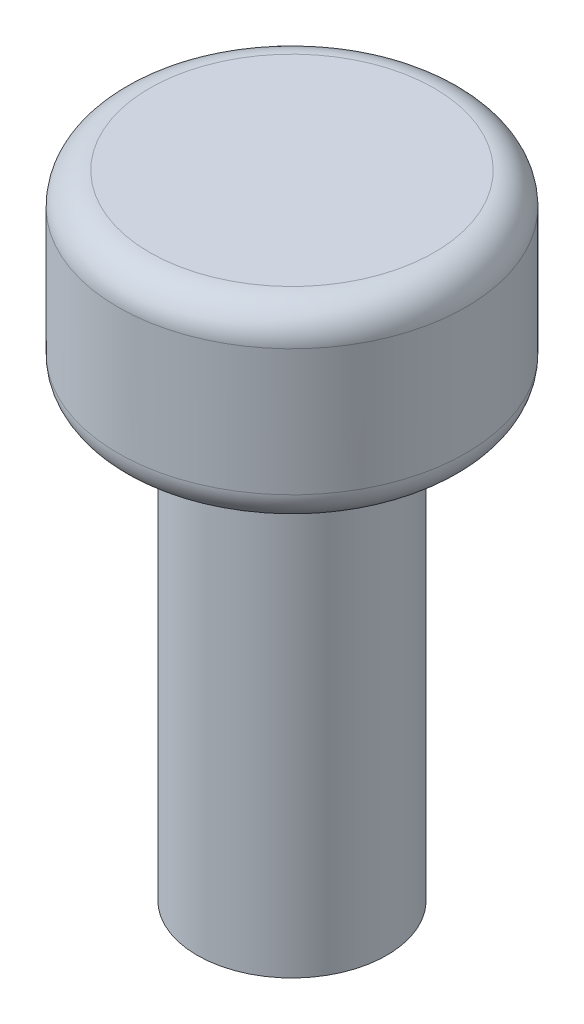
ISO-10303-21;
HEADER;
FILE_DESCRIPTION(('STEP AP214'),'2;1');
FILE_NAME('part.step','',(''),(''),'','','');
FILE_SCHEMA(('AUTOMOTIVE_DESIGN { 1 0 10303 214 1 1 1 1 }'));
ENDSEC;
DATA;
#1=APPLICATION_CONTEXT('core data for automotive mechanical design processes');
#2=APPLICATION_PROTOCOL_DEFINITION('international standard','automotive_design',2000,#1);
#3=PRODUCT_CONTEXT('',#1,'mechanical');
#4=PRODUCT('Part','Part','',(#3));
#5=PRODUCT_RELATED_PRODUCT_CATEGORY('part','',(#4));
#6=PRODUCT_DEFINITION_FORMATION('','',#4);
#7=PRODUCT_DEFINITION_CONTEXT('part definition',#1,'design');
#8=PRODUCT_DEFINITION('design','',#6,#7);
#9=PRODUCT_DEFINITION_SHAPE('','',#8);
#10=(LENGTH_UNIT() NAMED_UNIT(*) SI_UNIT(.MILLI.,.METRE.));
#11=(NAMED_UNIT(*) PLANE_ANGLE_UNIT() SI_UNIT($,.RADIAN.));
#12=(NAMED_UNIT(*) SI_UNIT($,.STERADIAN.) SOLID_ANGLE_UNIT());
#13=UNCERTAINTY_MEASURE_WITH_UNIT(LENGTH_MEASURE(1.E-05),#10,'distance_accuracy_value','');
#14=(GEOMETRIC_REPRESENTATION_CONTEXT(3) GLOBAL_UNCERTAINTY_ASSIGNED_CONTEXT((#13)) GLOBAL_UNIT_ASSIGNED_CONTEXT((#10,
#11,#12)) REPRESENTATION_CONTEXT('',''));
#15=CARTESIAN_POINT('',(0.,0.,0.));
#16=DIRECTION('',(0.,0.,1.));
#17=DIRECTION('',(1.,0.,0.));
#18=AXIS2_PLACEMENT_3D('',#15,#16,#17);
#19=CARTESIAN_POINT('',(0.,0.,0.));
#20=DIRECTION('',(0.,-1.,0.));
#21=DIRECTION('',(0.,0.,-1.));
#22=AXIS2_PLACEMENT_3D('',#19,#20,#21);
#23=PLANE('',#22);
#24=CARTESIAN_POINT('',(0.,0.,0.));
#25=DIRECTION('',(0.,-1.,0.));
#26=DIRECTION('',(0.,0.,-1.));
#27=AXIS2_PLACEMENT_3D('',#24,#25,#26);
#28=CIRCLE('',#27,1.5);
#29=CARTESIAN_POINT('',(0.,0.,-1.5));
#30=VERTEX_POINT('',#29);
#31=EDGE_CURVE('E57',#30,#30,#28,.T.);
#32=ORIENTED_EDGE('',*,*,#31,.T.);
#33=EDGE_LOOP('',(#32));
#34=FACE_BOUND('',#33,.T.);
#35=ADVANCED_FACE('F34',(#34),#23,.T.);
#36=CARTESIAN_POINT('',(0.,10.,0.));
#37=DIRECTION('',(0.,1.,0.));
#38=DIRECTION('',(0.,0.,1.));
#39=AXIS2_PLACEMENT_3D('',#36,#37,#38);
#40=PLANE('',#39);
#41=CARTESIAN_POINT('',(0.,10.,0.));
#42=DIRECTION('',(0.,1.,0.));
#43=DIRECTION('',(0.,0.,1.));
#44=AXIS2_PLACEMENT_3D('',#41,#42,#43);
#45=CIRCLE('',#44,2.25);
#46=CARTESIAN_POINT('',(0.,10.,2.25));
#47=VERTEX_POINT('',#46);
#48=EDGE_CURVE('E10',#47,#47,#45,.T.);
#49=ORIENTED_EDGE('',*,*,#48,.T.);
#50=EDGE_LOOP('',(#49));
#51=FACE_BOUND('',#50,.T.);
#52=ADVANCED_FACE('F77',(#51),#40,.T.);
#53=CARTESIAN_POINT('',(0.,0.,0.));
#54=DIRECTION('',(0.,-1.,0.));
#55=DIRECTION('',(0.,0.,-1.));
#56=AXIS2_PLACEMENT_3D('',#53,#54,#55);
#57=CYLINDRICAL_SURFACE('',#56,2.75);
#58=CARTESIAN_POINT('',(0.,7.5,0.));
#59=DIRECTION('',(0.,-1.,0.));
#60=DIRECTION('',(0.,0.,-1.));
#61=AXIS2_PLACEMENT_3D('',#58,#59,#60);
#62=CIRCLE('',#61,2.75);
#63=CARTESIAN_POINT('',(0.,7.5,-2.75));
#64=VERTEX_POINT('',#63);
#65=EDGE_CURVE('E41',#64,#64,#62,.F.);
#66=ORIENTED_EDGE('',*,*,#65,.T.);
#67=EDGE_LOOP('',(#66));
#68=FACE_BOUND('',#67,.T.);
#69=CARTESIAN_POINT('',(0.,9.5,0.));
#70=DIRECTION('',(0.,1.,0.));
#71=DIRECTION('',(0.,0.,1.));
#72=AXIS2_PLACEMENT_3D('',#69,#70,#71);
#73=CIRCLE('',#72,2.75);
#74=CARTESIAN_POINT('',(0.,9.5,2.75));
#75=VERTEX_POINT('',#74);
#76=EDGE_CURVE('E45',#75,#75,#73,.F.);
#77=ORIENTED_EDGE('',*,*,#76,.T.);
#78=EDGE_LOOP('',(#77));
#79=FACE_BOUND('',#78,.T.);
#80=ADVANCED_FACE('F73',(#68,#79),#57,.T.);
#81=CARTESIAN_POINT('',(1.5,7.,0.));
#82=DIRECTION('',(0.,-1.,0.));
#83=DIRECTION('',(0.,0.,-1.));
#84=AXIS2_PLACEMENT_3D('',#81,#82,#83);
#85=PLANE('',#84);
#86=CARTESIAN_POINT('',(0.,7.,0.));
#87=DIRECTION('',(0.,-1.,0.));
#88=DIRECTION('',(0.,0.,-1.));
#89=AXIS2_PLACEMENT_3D('',#86,#87,#88);
#90=CIRCLE('',#89,2.25);
#91=CARTESIAN_POINT('',(0.,7.,-2.25));
#92=VERTEX_POINT('',#91);
#93=EDGE_CURVE('E49',#92,#92,#90,.T.);
#94=ORIENTED_EDGE('',*,*,#93,.T.);
#95=EDGE_LOOP('',(#94));
#96=FACE_BOUND('',#95,.T.);
#97=CARTESIAN_POINT('',(0.,7.,0.));
#98=DIRECTION('',(0.,-1.,0.));
#99=DIRECTION('',(0.,0.,-1.));
#100=AXIS2_PLACEMENT_3D('',#97,#98,#99);
#101=CIRCLE('',#100,1.5);
#102=CARTESIAN_POINT('',(0.,7.,-1.5));
#103=VERTEX_POINT('',#102);
#104=EDGE_CURVE('E54',#103,#103,#101,.T.);
#105=ORIENTED_EDGE('',*,*,#104,.F.);
#106=EDGE_LOOP('',(#105));
#107=FACE_BOUND('',#106,.T.);
#108=ADVANCED_FACE('F65',(#96,#107),#85,.T.);
#109=CARTESIAN_POINT('',(0.,0.,0.));
#110=DIRECTION('',(0.,-1.,0.));
#111=DIRECTION('',(0.,0.,-1.));
#112=AXIS2_PLACEMENT_3D('',#109,#110,#111);
#113=CYLINDRICAL_SURFACE('',#112,1.5);
#114=ORIENTED_EDGE('',*,*,#104,.T.);
#115=EDGE_LOOP('',(#114));
#116=FACE_BOUND('',#115,.T.);
#117=ORIENTED_EDGE('',*,*,#31,.F.);
#118=EDGE_LOOP('',(#117));
#119=FACE_BOUND('',#118,.T.);
#120=ADVANCED_FACE('F62',(#116,#119),#113,.T.);
#121=CARTESIAN_POINT('',(0.,7.5,0.));
#122=DIRECTION('',(0.,-1.,0.));
#123=DIRECTION('',(0.,0.,-1.));
#124=AXIS2_PLACEMENT_3D('',#121,#122,#123);
#125=TOROIDAL_SURFACE('',#124,2.25,0.5);
#126=ORIENTED_EDGE('',*,*,#65,.F.);
#127=EDGE_LOOP('',(#126));
#128=FACE_BOUND('',#127,.T.);
#129=ORIENTED_EDGE('',*,*,#93,.F.);
#130=EDGE_LOOP('',(#129));
#131=FACE_BOUND('',#130,.T.);
#132=ADVANCED_FACE('F64',(#128,#131),#125,.T.);
#133=CARTESIAN_POINT('',(0.,9.5,0.));
#134=DIRECTION('',(0.,1.,0.));
#135=DIRECTION('',(0.,0.,1.));
#136=AXIS2_PLACEMENT_3D('',#133,#134,#135);
#137=TOROIDAL_SURFACE('',#136,2.25,0.5);
#138=ORIENTED_EDGE('',*,*,#48,.F.);
#139=EDGE_LOOP('',(#138));
#140=FACE_BOUND('',#139,.T.);
#141=ORIENTED_EDGE('',*,*,#76,.F.);
#142=EDGE_LOOP('',(#141));
#143=FACE_BOUND('',#142,.T.);
#144=ADVANCED_FACE('F36',(#140,#143),#137,.T.);
#145=CLOSED_SHELL('',(#35,#52,#80,#108,#120,#132,#144));
#146=MANIFOLD_SOLID_BREP('B2',#145);
#147=ADVANCED_BREP_SHAPE_REPRESENTATION('',(#18,#146),#14);
#148=SHAPE_DEFINITION_REPRESENTATION(#9,#147);
ENDSEC;
END-ISO-10303-21;
